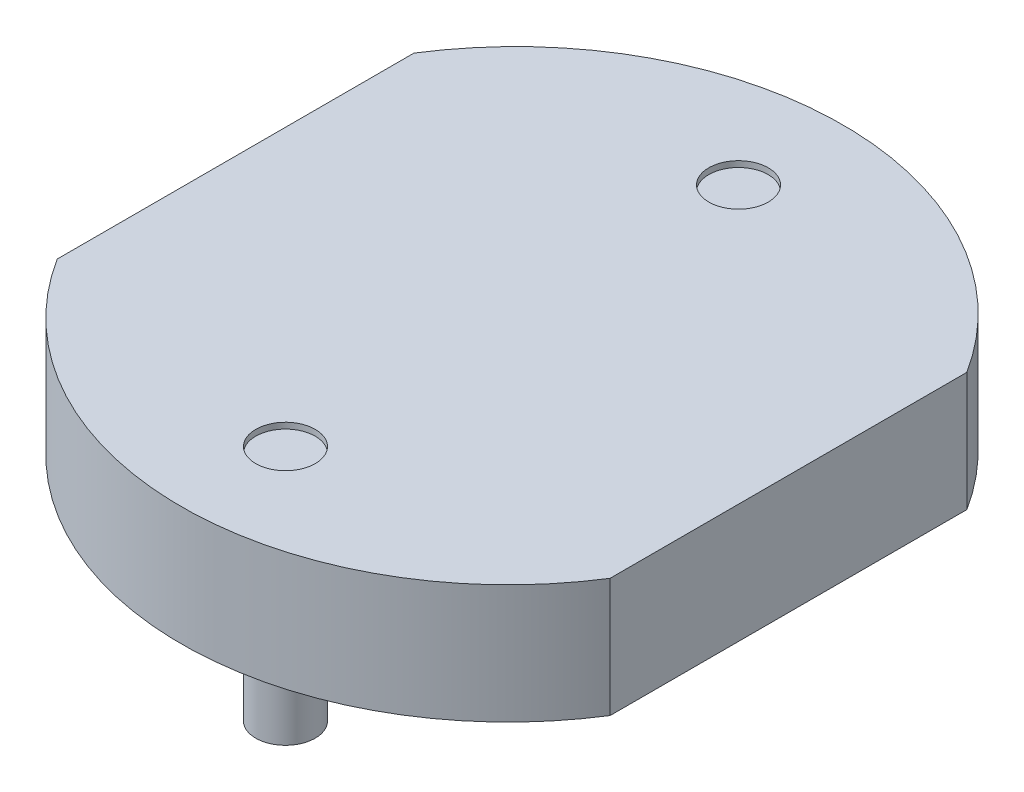
ISO-10303-21;
HEADER;
FILE_DESCRIPTION(('STEP AP214'),'2;1');
FILE_NAME('part.step','',(''),(''),'','','');
FILE_SCHEMA(('AUTOMOTIVE_DESIGN { 1 0 10303 214 1 1 1 1 }'));
ENDSEC;
DATA;
#1=APPLICATION_CONTEXT('core data for automotive mechanical design processes');
#2=APPLICATION_PROTOCOL_DEFINITION('international standard','automotive_design',2000,#1);
#3=PRODUCT_CONTEXT('',#1,'mechanical');
#4=PRODUCT('Part','Part','',(#3));
#5=PRODUCT_RELATED_PRODUCT_CATEGORY('part','',(#4));
#6=PRODUCT_DEFINITION_FORMATION('','',#4);
#7=PRODUCT_DEFINITION_CONTEXT('part definition',#1,'design');
#8=PRODUCT_DEFINITION('design','',#6,#7);
#9=PRODUCT_DEFINITION_SHAPE('','',#8);
#10=(LENGTH_UNIT() NAMED_UNIT(*) SI_UNIT(.MILLI.,.METRE.));
#11=(NAMED_UNIT(*) PLANE_ANGLE_UNIT() SI_UNIT($,.RADIAN.));
#12=(NAMED_UNIT(*) SI_UNIT($,.STERADIAN.) SOLID_ANGLE_UNIT());
#13=UNCERTAINTY_MEASURE_WITH_UNIT(LENGTH_MEASURE(1.E-05),#10,'distance_accuracy_value','');
#14=(GEOMETRIC_REPRESENTATION_CONTEXT(3) GLOBAL_UNCERTAINTY_ASSIGNED_CONTEXT((#13)) GLOBAL_UNIT_ASSIGNED_CONTEXT((#10,
#11,#12)) REPRESENTATION_CONTEXT('',''));
#15=CARTESIAN_POINT('',(0.,0.,0.));
#16=DIRECTION('',(0.,0.,1.));
#17=DIRECTION('',(1.,0.,0.));
#18=AXIS2_PLACEMENT_3D('',#15,#16,#17);
#19=CARTESIAN_POINT('',(0.,0.,-0.0627393714550967));
#20=DIRECTION('',(0.,-1.,0.));
#21=DIRECTION('',(0.,0.,-1.));
#22=AXIS2_PLACEMENT_3D('',#19,#20,#21);
#23=PLANE('',#22);
#24=CARTESIAN_POINT('',(0.,0.,3.81));
#25=DIRECTION('',(0.,-1.,0.));
#26=DIRECTION('',(0.,0.,-1.));
#27=AXIS2_PLACEMENT_3D('',#24,#25,#26);
#28=CIRCLE('',#27,0.5);
#29=CARTESIAN_POINT('',(0.,0.,3.31));
#30=VERTEX_POINT('',#29);
#31=EDGE_CURVE('E111',#30,#30,#28,.T.);
#32=ORIENTED_EDGE('',*,*,#31,.F.);
#33=EDGE_LOOP('',(#32));
#34=FACE_BOUND('',#33,.T.);
#35=CARTESIAN_POINT('',(0.,0.,-0.0627393714550967));
#36=DIRECTION('',(0.,1.,0.));
#37=DIRECTION('',(0.,0.,-1.));
#38=AXIS2_PLACEMENT_3D('',#35,#36,#37);
#39=CIRCLE('',#38,5.5);
#40=CARTESIAN_POINT('',(4.65,0.,-3.));
#41=VERTEX_POINT('',#40);
#42=CARTESIAN_POINT('',(-4.65,0.,-3.));
#43=VERTEX_POINT('',#42);
#44=EDGE_CURVE('E97',#41,#43,#39,.T.);
#45=ORIENTED_EDGE('',*,*,#44,.F.);
#46=DIRECTION('',(0.,0.,-1.));
#47=VECTOR('',#46,1.);
#48=CARTESIAN_POINT('',(4.65,0.,-3.));
#49=LINE('',#48,#47);
#50=CARTESIAN_POINT('',(4.65,0.,3.));
#51=VERTEX_POINT('',#50);
#52=EDGE_CURVE('E73',#51,#41,#49,.T.);
#53=ORIENTED_EDGE('',*,*,#52,.F.);
#54=CARTESIAN_POINT('',(0.,0.,0.0627393714550967));
#55=DIRECTION('',(0.,1.,0.));
#56=DIRECTION('',(0.,0.,1.));
#57=AXIS2_PLACEMENT_3D('',#54,#55,#56);
#58=CIRCLE('',#57,5.5);
#59=CARTESIAN_POINT('',(-4.65,0.,3.));
#60=VERTEX_POINT('',#59);
#61=EDGE_CURVE('E67',#60,#51,#58,.T.);
#62=ORIENTED_EDGE('',*,*,#61,.F.);
#63=DIRECTION('',(0.,0.,1.));
#64=VECTOR('',#63,1.);
#65=CARTESIAN_POINT('',(-4.65,0.,-3.));
#66=LINE('',#65,#64);
#67=EDGE_CURVE('E89',#43,#60,#66,.T.);
#68=ORIENTED_EDGE('',*,*,#67,.F.);
#69=EDGE_LOOP('',(#45,#53,#62,#68));
#70=FACE_BOUND('',#69,.T.);
#71=CARTESIAN_POINT('',(0.,0.,-3.81));
#72=DIRECTION('',(0.,-1.,0.));
#73=DIRECTION('',(0.,0.,1.));
#74=AXIS2_PLACEMENT_3D('',#71,#72,#73);
#75=CIRCLE('',#74,0.5);
#76=CARTESIAN_POINT('',(0.,0.,-3.31));
#77=VERTEX_POINT('',#76);
#78=EDGE_CURVE('E117',#77,#77,#75,.T.);
#79=ORIENTED_EDGE('',*,*,#78,.F.);
#80=EDGE_LOOP('',(#79));
#81=FACE_BOUND('',#80,.T.);
#82=ADVANCED_FACE('F33',(#34,#70,#81),#23,.T.);
#83=CARTESIAN_POINT('',(0.,2.,-0.0627393714550967));
#84=DIRECTION('',(0.,-1.,0.));
#85=DIRECTION('',(0.,0.,-1.));
#86=AXIS2_PLACEMENT_3D('',#83,#84,#85);
#87=CYLINDRICAL_SURFACE('',#86,5.5);
#88=ORIENTED_EDGE('',*,*,#44,.T.);
#89=DIRECTION('',(0.,-1.,0.));
#90=VECTOR('',#89,1.);
#91=CARTESIAN_POINT('',(-4.65,2.,-3.));
#92=LINE('',#91,#90);
#93=CARTESIAN_POINT('',(-4.65,2.,-3.));
#94=VERTEX_POINT('',#93);
#95=EDGE_CURVE('E11',#94,#43,#92,.T.);
#96=ORIENTED_EDGE('',*,*,#95,.F.);
#97=CARTESIAN_POINT('',(0.,2.,-0.0627393714550967));
#98=DIRECTION('',(0.,1.,0.));
#99=DIRECTION('',(0.,0.,-1.));
#100=AXIS2_PLACEMENT_3D('',#97,#98,#99);
#101=CIRCLE('',#100,5.5);
#102=CARTESIAN_POINT('',(4.65,2.,-3.));
#103=VERTEX_POINT('',#102);
#104=EDGE_CURVE('E85',#103,#94,#101,.T.);
#105=ORIENTED_EDGE('',*,*,#104,.F.);
#106=DIRECTION('',(0.,-1.,0.));
#107=VECTOR('',#106,1.);
#108=CARTESIAN_POINT('',(4.65,2.,-3.));
#109=LINE('',#108,#107);
#110=EDGE_CURVE('E93',#103,#41,#109,.T.);
#111=ORIENTED_EDGE('',*,*,#110,.T.);
#112=EDGE_LOOP('',(#88,#96,#105,#111));
#113=FACE_BOUND('',#112,.T.);
#114=ADVANCED_FACE('F35',(#113),#87,.T.);
#115=CARTESIAN_POINT('',(-4.65,2.,-3.));
#116=DIRECTION('',(1.,0.,0.));
#117=DIRECTION('',(0.,0.,-1.));
#118=AXIS2_PLACEMENT_3D('',#115,#116,#117);
#119=PLANE('',#118);
#120=ORIENTED_EDGE('',*,*,#67,.T.);
#121=DIRECTION('',(0.,-1.,0.));
#122=VECTOR('',#121,1.);
#123=CARTESIAN_POINT('',(-4.65,2.,3.));
#124=LINE('',#123,#122);
#125=CARTESIAN_POINT('',(-4.65,2.,3.));
#126=VERTEX_POINT('',#125);
#127=EDGE_CURVE('E42',#126,#60,#124,.T.);
#128=ORIENTED_EDGE('',*,*,#127,.F.);
#129=DIRECTION('',(0.,0.,1.));
#130=VECTOR('',#129,1.);
#131=CARTESIAN_POINT('',(-4.65,2.,-3.));
#132=LINE('',#131,#130);
#133=EDGE_CURVE('E80',#94,#126,#132,.T.);
#134=ORIENTED_EDGE('',*,*,#133,.F.);
#135=ORIENTED_EDGE('',*,*,#95,.T.);
#136=EDGE_LOOP('',(#120,#128,#134,#135));
#137=FACE_BOUND('',#136,.T.);
#138=ADVANCED_FACE('F88',(#137),#119,.F.);
#139=CARTESIAN_POINT('',(0.,2.,0.0627393714550967));
#140=DIRECTION('',(0.,-1.,0.));
#141=DIRECTION('',(0.,0.,-1.));
#142=AXIS2_PLACEMENT_3D('',#139,#140,#141);
#143=CYLINDRICAL_SURFACE('',#142,5.5);
#144=ORIENTED_EDGE('',*,*,#61,.T.);
#145=DIRECTION('',(0.,-1.,0.));
#146=VECTOR('',#145,1.);
#147=CARTESIAN_POINT('',(4.65,2.,3.));
#148=LINE('',#147,#146);
#149=CARTESIAN_POINT('',(4.65,2.,3.));
#150=VERTEX_POINT('',#149);
#151=EDGE_CURVE('E90',#150,#51,#148,.T.);
#152=ORIENTED_EDGE('',*,*,#151,.F.);
#153=CARTESIAN_POINT('',(0.,2.,0.0627393714550967));
#154=DIRECTION('',(0.,1.,0.));
#155=DIRECTION('',(0.,0.,1.));
#156=AXIS2_PLACEMENT_3D('',#153,#154,#155);
#157=CIRCLE('',#156,5.5);
#158=EDGE_CURVE('E83',#126,#150,#157,.T.);
#159=ORIENTED_EDGE('',*,*,#158,.F.);
#160=ORIENTED_EDGE('',*,*,#127,.T.);
#161=EDGE_LOOP('',(#144,#152,#159,#160));
#162=FACE_BOUND('',#161,.T.);
#163=ADVANCED_FACE('F91',(#162),#143,.T.);
#164=CARTESIAN_POINT('',(4.65,2.,-3.));
#165=DIRECTION('',(-1.,0.,0.));
#166=DIRECTION('',(0.,0.,1.));
#167=AXIS2_PLACEMENT_3D('',#164,#165,#166);
#168=PLANE('',#167);
#169=ORIENTED_EDGE('',*,*,#52,.T.);
#170=ORIENTED_EDGE('',*,*,#110,.F.);
#171=DIRECTION('',(0.,0.,-1.));
#172=VECTOR('',#171,1.);
#173=CARTESIAN_POINT('',(4.65,2.,-3.));
#174=LINE('',#173,#172);
#175=EDGE_CURVE('E50',#150,#103,#174,.T.);
#176=ORIENTED_EDGE('',*,*,#175,.F.);
#177=ORIENTED_EDGE('',*,*,#151,.T.);
#178=EDGE_LOOP('',(#169,#170,#176,#177));
#179=FACE_BOUND('',#178,.T.);
#180=ADVANCED_FACE('F105',(#179),#168,.F.);
#181=CARTESIAN_POINT('',(0.,2.,-0.0627393714550967));
#182=DIRECTION('',(0.,-1.,0.));
#183=DIRECTION('',(0.,0.,-1.));
#184=AXIS2_PLACEMENT_3D('',#181,#182,#183);
#185=PLANE('',#184);
#186=CARTESIAN_POINT('',(0.,2.,3.81));
#187=DIRECTION('',(0.,1.,0.));
#188=DIRECTION('',(0.,0.,-1.));
#189=AXIS2_PLACEMENT_3D('',#186,#187,#188);
#190=CIRCLE('',#189,0.5);
#191=CARTESIAN_POINT('',(0.,2.,3.31));
#192=VERTEX_POINT('',#191);
#193=EDGE_CURVE('E129',#192,#192,#190,.T.);
#194=ORIENTED_EDGE('',*,*,#193,.F.);
#195=EDGE_LOOP('',(#194));
#196=FACE_BOUND('',#195,.T.);
#197=CARTESIAN_POINT('',(0.,2.,-3.81));
#198=DIRECTION('',(0.,1.,0.));
#199=DIRECTION('',(0.,0.,1.));
#200=AXIS2_PLACEMENT_3D('',#197,#198,#199);
#201=CIRCLE('',#200,0.5);
#202=CARTESIAN_POINT('',(0.,2.,-3.31));
#203=VERTEX_POINT('',#202);
#204=EDGE_CURVE('E123',#203,#203,#201,.T.);
#205=ORIENTED_EDGE('',*,*,#204,.F.);
#206=EDGE_LOOP('',(#205));
#207=FACE_BOUND('',#206,.T.);
#208=ORIENTED_EDGE('',*,*,#104,.T.);
#209=ORIENTED_EDGE('',*,*,#133,.T.);
#210=ORIENTED_EDGE('',*,*,#158,.T.);
#211=ORIENTED_EDGE('',*,*,#175,.T.);
#212=EDGE_LOOP('',(#208,#209,#210,#211));
#213=FACE_BOUND('',#212,.T.);
#214=ADVANCED_FACE('F81',(#196,#207,#213),#185,.F.);
#215=CARTESIAN_POINT('',(0.,-2.,3.81));
#216=DIRECTION('',(0.,1.,0.));
#217=DIRECTION('',(0.,0.,1.));
#218=AXIS2_PLACEMENT_3D('',#215,#216,#217);
#219=CYLINDRICAL_SURFACE('',#218,0.5);
#220=CARTESIAN_POINT('',(0.,-2.,3.81));
#221=DIRECTION('',(0.,-1.,0.));
#222=DIRECTION('',(0.,0.,-1.));
#223=AXIS2_PLACEMENT_3D('',#220,#221,#222);
#224=CIRCLE('',#223,0.5);
#225=CARTESIAN_POINT('',(0.,-2.,3.31));
#226=VERTEX_POINT('',#225);
#227=EDGE_CURVE('E100',#226,#226,#224,.T.);
#228=ORIENTED_EDGE('',*,*,#227,.F.);
#229=EDGE_LOOP('',(#228));
#230=FACE_BOUND('',#229,.T.);
#231=ORIENTED_EDGE('',*,*,#31,.T.);
#232=EDGE_LOOP('',(#231));
#233=FACE_BOUND('',#232,.T.);
#234=ADVANCED_FACE('F146',(#230,#233),#219,.T.);
#235=CARTESIAN_POINT('',(0.,-2.,3.81));
#236=DIRECTION('',(0.,-1.,0.));
#237=DIRECTION('',(0.,0.,-1.));
#238=AXIS2_PLACEMENT_3D('',#235,#236,#237);
#239=PLANE('',#238);
#240=ORIENTED_EDGE('',*,*,#227,.T.);
#241=EDGE_LOOP('',(#240));
#242=FACE_BOUND('',#241,.T.);
#243=ADVANCED_FACE('F201',(#242),#239,.T.);
#244=CARTESIAN_POINT('',(0.,-2.,-3.81));
#245=DIRECTION('',(0.,1.,0.));
#246=DIRECTION('',(0.,0.,1.));
#247=AXIS2_PLACEMENT_3D('',#244,#245,#246);
#248=CYLINDRICAL_SURFACE('',#247,0.5);
#249=CARTESIAN_POINT('',(0.,-2.,-3.81));
#250=DIRECTION('',(0.,-1.,0.));
#251=DIRECTION('',(0.,0.,1.));
#252=AXIS2_PLACEMENT_3D('',#249,#250,#251);
#253=CIRCLE('',#252,0.5);
#254=CARTESIAN_POINT('',(0.,-2.,-3.31));
#255=VERTEX_POINT('',#254);
#256=EDGE_CURVE('E114',#255,#255,#253,.T.);
#257=ORIENTED_EDGE('',*,*,#256,.F.);
#258=EDGE_LOOP('',(#257));
#259=FACE_BOUND('',#258,.T.);
#260=ORIENTED_EDGE('',*,*,#78,.T.);
#261=EDGE_LOOP('',(#260));
#262=FACE_BOUND('',#261,.T.);
#263=ADVANCED_FACE('F161',(#259,#262),#248,.T.);
#264=CARTESIAN_POINT('',(0.,-2.,-3.81));
#265=DIRECTION('',(0.,1.,0.));
#266=DIRECTION('',(0.,0.,1.));
#267=AXIS2_PLACEMENT_3D('',#264,#265,#266);
#268=PLANE('',#267);
#269=ORIENTED_EDGE('',*,*,#256,.T.);
#270=EDGE_LOOP('',(#269));
#271=FACE_BOUND('',#270,.T.);
#272=ADVANCED_FACE('F152',(#271),#268,.F.);
#273=CARTESIAN_POINT('',(0.,1.9,-3.81));
#274=DIRECTION('',(0.,1.,0.));
#275=DIRECTION('',(0.,0.,1.));
#276=AXIS2_PLACEMENT_3D('',#273,#274,#275);
#277=CYLINDRICAL_SURFACE('',#276,0.5);
#278=CARTESIAN_POINT('',(0.,1.9,-3.81));
#279=DIRECTION('',(0.,1.,0.));
#280=DIRECTION('',(0.,0.,1.));
#281=AXIS2_PLACEMENT_3D('',#278,#279,#280);
#282=CIRCLE('',#281,0.5);
#283=CARTESIAN_POINT('',(0.,1.9,-3.31));
#284=VERTEX_POINT('',#283);
#285=EDGE_CURVE('E120',#284,#284,#282,.T.);
#286=ORIENTED_EDGE('',*,*,#285,.F.);
#287=EDGE_LOOP('',(#286));
#288=FACE_BOUND('',#287,.T.);
#289=ORIENTED_EDGE('',*,*,#204,.T.);
#290=EDGE_LOOP('',(#289));
#291=FACE_BOUND('',#290,.T.);
#292=ADVANCED_FACE('F150',(#288,#291),#277,.F.);
#293=CARTESIAN_POINT('',(0.,1.9,-3.81));
#294=DIRECTION('',(0.,1.,0.));
#295=DIRECTION('',(0.,0.,1.));
#296=AXIS2_PLACEMENT_3D('',#293,#294,#295);
#297=PLANE('',#296);
#298=ORIENTED_EDGE('',*,*,#285,.T.);
#299=EDGE_LOOP('',(#298));
#300=FACE_BOUND('',#299,.T.);
#301=ADVANCED_FACE('F140',(#300),#297,.T.);
#302=CARTESIAN_POINT('',(0.,1.9,3.81));
#303=DIRECTION('',(0.,1.,0.));
#304=DIRECTION('',(0.,0.,1.));
#305=AXIS2_PLACEMENT_3D('',#302,#303,#304);
#306=CYLINDRICAL_SURFACE('',#305,0.5);
#307=CARTESIAN_POINT('',(0.,1.9,3.81));
#308=DIRECTION('',(0.,1.,0.));
#309=DIRECTION('',(0.,0.,-1.));
#310=AXIS2_PLACEMENT_3D('',#307,#308,#309);
#311=CIRCLE('',#310,0.5);
#312=CARTESIAN_POINT('',(0.,1.9,3.31));
#313=VERTEX_POINT('',#312);
#314=EDGE_CURVE('E126',#313,#313,#311,.T.);
#315=ORIENTED_EDGE('',*,*,#314,.F.);
#316=EDGE_LOOP('',(#315));
#317=FACE_BOUND('',#316,.T.);
#318=ORIENTED_EDGE('',*,*,#193,.T.);
#319=EDGE_LOOP('',(#318));
#320=FACE_BOUND('',#319,.T.);
#321=ADVANCED_FACE('F137',(#317,#320),#306,.F.);
#322=CARTESIAN_POINT('',(0.,1.9,3.81));
#323=DIRECTION('',(0.,-1.,0.));
#324=DIRECTION('',(0.,0.,-1.));
#325=AXIS2_PLACEMENT_3D('',#322,#323,#324);
#326=PLANE('',#325);
#327=ORIENTED_EDGE('',*,*,#314,.T.);
#328=EDGE_LOOP('',(#327));
#329=FACE_BOUND('',#328,.T.);
#330=ADVANCED_FACE('F135',(#329),#326,.F.);
#331=CLOSED_SHELL('',(#82,#114,#138,#163,#180,#214,#234,#243,#263,#272,#292,#301,#321,#330));
#332=MANIFOLD_SOLID_BREP('B2',#331);
#333=ADVANCED_BREP_SHAPE_REPRESENTATION('',(#18,#332),#14);
#334=SHAPE_DEFINITION_REPRESENTATION(#9,#333);
ENDSEC;
END-ISO-10303-21;
